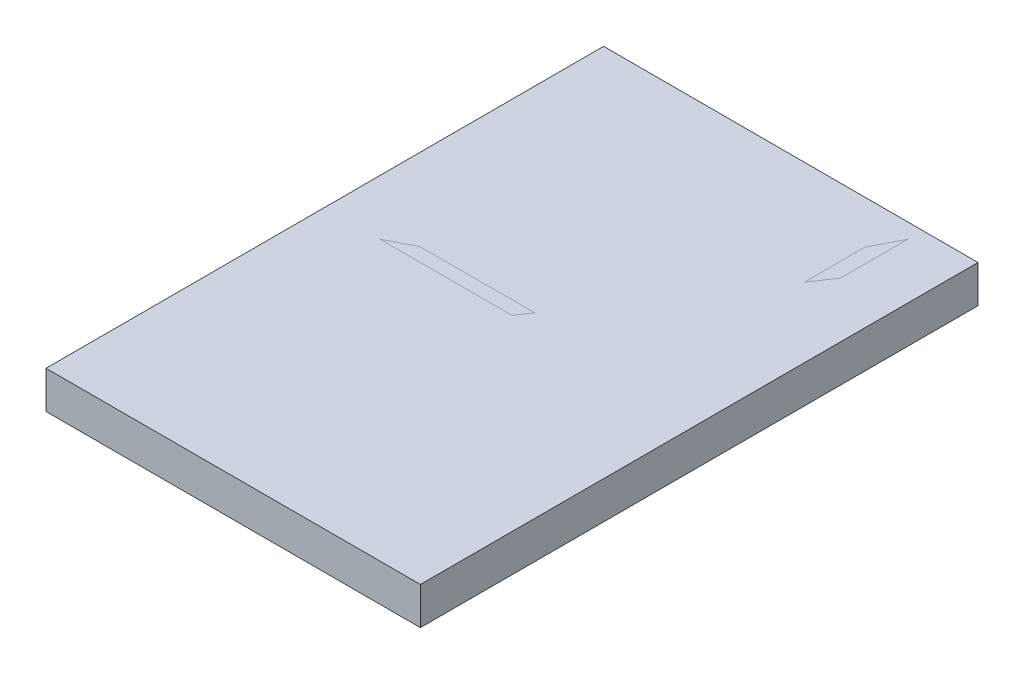
ISO-10303-21;
HEADER;
FILE_DESCRIPTION(('STEP AP214'),'2;1');
FILE_NAME('part.step','',(''),(''),'','','');
FILE_SCHEMA(('AUTOMOTIVE_DESIGN { 1 0 10303 214 1 1 1 1 }'));
ENDSEC;
DATA;
#1=APPLICATION_CONTEXT('core data for automotive mechanical design processes');
#2=APPLICATION_PROTOCOL_DEFINITION('international standard','automotive_design',2000,#1);
#3=PRODUCT_CONTEXT('',#1,'mechanical');
#4=PRODUCT('Part','Part','',(#3));
#5=PRODUCT_RELATED_PRODUCT_CATEGORY('part','',(#4));
#6=PRODUCT_DEFINITION_FORMATION('','',#4);
#7=PRODUCT_DEFINITION_CONTEXT('part definition',#1,'design');
#8=PRODUCT_DEFINITION('design','',#6,#7);
#9=PRODUCT_DEFINITION_SHAPE('','',#8);
#10=(LENGTH_UNIT() NAMED_UNIT(*) SI_UNIT(.MILLI.,.METRE.));
#11=(NAMED_UNIT(*) PLANE_ANGLE_UNIT() SI_UNIT($,.RADIAN.));
#12=(NAMED_UNIT(*) SI_UNIT($,.STERADIAN.) SOLID_ANGLE_UNIT());
#13=UNCERTAINTY_MEASURE_WITH_UNIT(LENGTH_MEASURE(1.E-05),#10,'distance_accuracy_value','');
#14=(GEOMETRIC_REPRESENTATION_CONTEXT(3) GLOBAL_UNCERTAINTY_ASSIGNED_CONTEXT((#13)) GLOBAL_UNIT_ASSIGNED_CONTEXT((#10,
#11,#12)) REPRESENTATION_CONTEXT('',''));
#15=CARTESIAN_POINT('',(0.,0.,0.));
#16=DIRECTION('',(0.,0.,1.));
#17=DIRECTION('',(1.,0.,0.));
#18=AXIS2_PLACEMENT_3D('',#15,#16,#17);
#19=CARTESIAN_POINT('',(68.2,0.,11.825));
#20=DIRECTION('',(1.,0.,0.));
#21=DIRECTION('',(0.,0.,-1.));
#22=AXIS2_PLACEMENT_3D('',#19,#20,#21);
#23=PLANE('',#22);
#24=DIRECTION('',(0.,0.,-1.));
#25=VECTOR('',#24,1.);
#26=CARTESIAN_POINT('',(68.2,8.,11.825));
#27=LINE('',#26,#25);
#28=CARTESIAN_POINT('',(68.2,8.,130.975));
#29=VERTEX_POINT('',#28);
#30=CARTESIAN_POINT('',(68.2,8.,11.825));
#31=VERTEX_POINT('',#30);
#32=EDGE_CURVE('E115',#29,#31,#27,.T.);
#33=ORIENTED_EDGE('',*,*,#32,.F.);
#34=DIRECTION('',(0.,1.,0.));
#35=VECTOR('',#34,1.);
#36=CARTESIAN_POINT('',(68.2,0.,130.975));
#37=LINE('',#36,#35);
#38=CARTESIAN_POINT('',(68.2,0.,130.975));
#39=VERTEX_POINT('',#38);
#40=EDGE_CURVE('E13',#39,#29,#37,.T.);
#41=ORIENTED_EDGE('',*,*,#40,.F.);
#42=DIRECTION('',(0.,0.,-1.));
#43=VECTOR('',#42,1.);
#44=CARTESIAN_POINT('',(68.2,0.,11.825));
#45=LINE('',#44,#43);
#46=CARTESIAN_POINT('',(68.2,0.,11.825));
#47=VERTEX_POINT('',#46);
#48=EDGE_CURVE('E109',#39,#47,#45,.T.);
#49=ORIENTED_EDGE('',*,*,#48,.T.);
#50=DIRECTION('',(0.,1.,0.));
#51=VECTOR('',#50,1.);
#52=CARTESIAN_POINT('',(68.2,0.,11.825));
#53=LINE('',#52,#51);
#54=EDGE_CURVE('E54',#47,#31,#53,.T.);
#55=ORIENTED_EDGE('',*,*,#54,.T.);
#56=EDGE_LOOP('',(#33,#41,#49,#55));
#57=FACE_BOUND('',#56,.T.);
#58=ADVANCED_FACE('F51',(#57),#23,.T.);
#59=CARTESIAN_POINT('',(-11.8,0.,130.975));
#60=DIRECTION('',(0.,0.,1.));
#61=DIRECTION('',(1.,0.,0.));
#62=AXIS2_PLACEMENT_3D('',#59,#60,#61);
#63=PLANE('',#62);
#64=DIRECTION('',(1.,0.,0.));
#65=VECTOR('',#64,1.);
#66=CARTESIAN_POINT('',(-11.8,8.,130.975));
#67=LINE('',#66,#65);
#68=CARTESIAN_POINT('',(-11.8,8.,130.975));
#69=VERTEX_POINT('',#68);
#70=EDGE_CURVE('E111',#69,#29,#67,.T.);
#71=ORIENTED_EDGE('',*,*,#70,.F.);
#72=DIRECTION('',(0.,1.,0.));
#73=VECTOR('',#72,1.);
#74=CARTESIAN_POINT('',(-11.8,0.,130.975));
#75=LINE('',#74,#73);
#76=CARTESIAN_POINT('',(-11.8,0.,130.975));
#77=VERTEX_POINT('',#76);
#78=EDGE_CURVE('E60',#77,#69,#75,.T.);
#79=ORIENTED_EDGE('',*,*,#78,.F.);
#80=DIRECTION('',(1.,0.,0.));
#81=VECTOR('',#80,1.);
#82=CARTESIAN_POINT('',(-11.8,0.,130.975));
#83=LINE('',#82,#81);
#84=EDGE_CURVE('E106',#77,#39,#83,.T.);
#85=ORIENTED_EDGE('',*,*,#84,.T.);
#86=ORIENTED_EDGE('',*,*,#40,.T.);
#87=EDGE_LOOP('',(#71,#79,#85,#86));
#88=FACE_BOUND('',#87,.T.);
#89=ADVANCED_FACE('F125',(#88),#63,.T.);
#90=CARTESIAN_POINT('',(-11.8,0.,11.825));
#91=DIRECTION('',(-1.,0.,0.));
#92=DIRECTION('',(0.,0.,1.));
#93=AXIS2_PLACEMENT_3D('',#90,#91,#92);
#94=PLANE('',#93);
#95=DIRECTION('',(0.,0.,1.));
#96=VECTOR('',#95,1.);
#97=CARTESIAN_POINT('',(-11.8,8.,11.825));
#98=LINE('',#97,#96);
#99=CARTESIAN_POINT('',(-11.8,8.,11.825));
#100=VERTEX_POINT('',#99);
#101=EDGE_CURVE('E101',#100,#69,#98,.T.);
#102=ORIENTED_EDGE('',*,*,#101,.F.);
#103=DIRECTION('',(0.,1.,0.));
#104=VECTOR('',#103,1.);
#105=CARTESIAN_POINT('',(-11.8,0.,11.825));
#106=LINE('',#105,#104);
#107=CARTESIAN_POINT('',(-11.8,0.,11.825));
#108=VERTEX_POINT('',#107);
#109=EDGE_CURVE('E96',#108,#100,#106,.T.);
#110=ORIENTED_EDGE('',*,*,#109,.F.);
#111=DIRECTION('',(0.,0.,1.));
#112=VECTOR('',#111,1.);
#113=CARTESIAN_POINT('',(-11.8,0.,11.825));
#114=LINE('',#113,#112);
#115=EDGE_CURVE('E99',#108,#77,#114,.T.);
#116=ORIENTED_EDGE('',*,*,#115,.T.);
#117=ORIENTED_EDGE('',*,*,#78,.T.);
#118=EDGE_LOOP('',(#102,#110,#116,#117));
#119=FACE_BOUND('',#118,.T.);
#120=ADVANCED_FACE('F98',(#119),#94,.T.);
#121=CARTESIAN_POINT('',(-11.8,0.,11.825));
#122=DIRECTION('',(0.,0.,-1.));
#123=DIRECTION('',(-1.,0.,0.));
#124=AXIS2_PLACEMENT_3D('',#121,#122,#123);
#125=PLANE('',#124);
#126=DIRECTION('',(-1.,0.,0.));
#127=VECTOR('',#126,1.);
#128=CARTESIAN_POINT('',(-11.8,8.,11.825));
#129=LINE('',#128,#127);
#130=EDGE_CURVE('E118',#31,#100,#129,.T.);
#131=ORIENTED_EDGE('',*,*,#130,.F.);
#132=ORIENTED_EDGE('',*,*,#54,.F.);
#133=DIRECTION('',(-1.,0.,0.));
#134=VECTOR('',#133,1.);
#135=CARTESIAN_POINT('',(-11.8,0.,11.825));
#136=LINE('',#135,#134);
#137=EDGE_CURVE('E105',#47,#108,#136,.T.);
#138=ORIENTED_EDGE('',*,*,#137,.T.);
#139=ORIENTED_EDGE('',*,*,#109,.T.);
#140=EDGE_LOOP('',(#131,#132,#138,#139));
#141=FACE_BOUND('',#140,.T.);
#142=ADVANCED_FACE('F108',(#141),#125,.T.);
#143=CARTESIAN_POINT('',(0.,0.,0.));
#144=DIRECTION('',(0.,1.,0.));
#145=DIRECTION('',(0.,0.,1.));
#146=AXIS2_PLACEMENT_3D('',#143,#144,#145);
#147=PLANE('',#146);
#148=ORIENTED_EDGE('',*,*,#48,.F.);
#149=ORIENTED_EDGE('',*,*,#84,.F.);
#150=ORIENTED_EDGE('',*,*,#115,.F.);
#151=ORIENTED_EDGE('',*,*,#137,.F.);
#152=EDGE_LOOP('',(#148,#149,#150,#151));
#153=FACE_BOUND('',#152,.T.);
#154=ADVANCED_FACE('F104',(#153),#147,.F.);
#155=CARTESIAN_POINT('',(0.,8.,0.));
#156=DIRECTION('',(0.,1.,0.));
#157=DIRECTION('',(0.,0.,1.));
#158=AXIS2_PLACEMENT_3D('',#155,#156,#157);
#159=PLANE('',#158);
#160=ORIENTED_EDGE('',*,*,#32,.T.);
#161=ORIENTED_EDGE('',*,*,#130,.T.);
#162=ORIENTED_EDGE('',*,*,#101,.T.);
#163=ORIENTED_EDGE('',*,*,#70,.T.);
#164=EDGE_LOOP('',(#160,#161,#162,#163));
#165=FACE_BOUND('',#164,.T.);
#166=ADVANCED_FACE('F124',(#165),#159,.T.);
#167=CLOSED_SHELL('',(#58,#89,#120,#142,#154,#166));
#168=MANIFOLD_SOLID_BREP('B2_NOT_SHOWN',#167);
#169=CARTESIAN_POINT('',(0.,8.,0.));
#170=DIRECTION('',(0.,1.,0.));
#171=DIRECTION('',(0.,0.,1.));
#172=AXIS2_PLACEMENT_3D('',#169,#170,#171);
#173=PLANE('',#172);
#174=DIRECTION('',(1.,0.,0.));
#175=VECTOR('',#174,1.);
#176=CARTESIAN_POINT('',(0.,8.,15.));
#177=LINE('',#176,#175);
#178=CARTESIAN_POINT('',(0.,8.,15.));
#179=VERTEX_POINT('',#178);
#180=CARTESIAN_POINT('',(56.4,8.,15.));
#181=VERTEX_POINT('',#180);
#182=EDGE_CURVE('E189',#179,#181,#177,.T.);
#183=ORIENTED_EDGE('',*,*,#182,.F.);
#184=DIRECTION('',(0.,0.,1.));
#185=VECTOR('',#184,1.);
#186=CARTESIAN_POINT('',(0.,8.,0.));
#187=LINE('',#186,#185);
#188=CARTESIAN_POINT('',(0.,8.,71.4));
#189=VERTEX_POINT('',#188);
#190=EDGE_CURVE('E227',#179,#189,#187,.T.);
#191=ORIENTED_EDGE('',*,*,#190,.T.);
#192=DIRECTION('',(1.,0.,0.));
#193=VECTOR('',#192,1.);
#194=CARTESIAN_POINT('',(0.,8.,71.4));
#195=LINE('',#194,#193);
#196=CARTESIAN_POINT('',(56.4,8.,71.4));
#197=VERTEX_POINT('',#196);
#198=EDGE_CURVE('E277',#189,#197,#195,.T.);
#199=ORIENTED_EDGE('',*,*,#198,.T.);
#200=DIRECTION('',(0.,0.,-1.));
#201=VECTOR('',#200,1.);
#202=CARTESIAN_POINT('',(56.4,8.,0.));
#203=LINE('',#202,#201);
#204=EDGE_CURVE('E229',#197,#181,#203,.T.);
#205=ORIENTED_EDGE('',*,*,#204,.T.);
#206=EDGE_LOOP('',(#183,#191,#199,#205));
#207=FACE_BOUND('',#206,.T.);
#208=CARTESIAN_POINT('',(4.58,8.,66.82));
#209=DIRECTION('',(0.,1.,0.));
#210=DIRECTION('',(0.,0.,-1.));
#211=AXIS2_PLACEMENT_3D('',#208,#209,#210);
#212=CIRCLE('',#211,2.);
#213=CARTESIAN_POINT('',(4.58,8.,64.82));
#214=VERTEX_POINT('',#213);
#215=EDGE_CURVE('E269',#214,#214,#212,.T.);
#216=ORIENTED_EDGE('',*,*,#215,.F.);
#217=EDGE_LOOP('',(#216));
#218=FACE_BOUND('',#217,.T.);
#219=CARTESIAN_POINT('',(51.82,8.,66.82));
#220=DIRECTION('',(0.,1.,0.));
#221=DIRECTION('',(0.,0.,1.));
#222=AXIS2_PLACEMENT_3D('',#219,#220,#221);
#223=CIRCLE('',#222,2.);
#224=CARTESIAN_POINT('',(51.82,8.,68.82));
#225=VERTEX_POINT('',#224);
#226=EDGE_CURVE('E263',#225,#225,#223,.T.);
#227=ORIENTED_EDGE('',*,*,#226,.F.);
#228=EDGE_LOOP('',(#227));
#229=FACE_BOUND('',#228,.T.);
#230=CARTESIAN_POINT('',(51.82,8.,19.58));
#231=DIRECTION('',(0.,1.,0.));
#232=DIRECTION('',(0.,0.,-1.));
#233=AXIS2_PLACEMENT_3D('',#230,#231,#232);
#234=CIRCLE('',#233,2.);
#235=CARTESIAN_POINT('',(51.82,8.,17.58));
#236=VERTEX_POINT('',#235);
#237=EDGE_CURVE('E257',#236,#236,#234,.T.);
#238=ORIENTED_EDGE('',*,*,#237,.F.);
#239=EDGE_LOOP('',(#238));
#240=FACE_BOUND('',#239,.T.);
#241=CARTESIAN_POINT('',(4.58,8.,19.58));
#242=DIRECTION('',(0.,1.,0.));
#243=DIRECTION('',(0.,0.,1.));
#244=AXIS2_PLACEMENT_3D('',#241,#242,#243);
#245=CIRCLE('',#244,2.);
#246=CARTESIAN_POINT('',(4.58,8.,21.58));
#247=VERTEX_POINT('',#246);
#248=EDGE_CURVE('E251',#247,#247,#245,.T.);
#249=ORIENTED_EDGE('',*,*,#248,.F.);
#250=EDGE_LOOP('',(#249));
#251=FACE_BOUND('',#250,.T.);
#252=CARTESIAN_POINT('',(28.2,8.,43.2));
#253=DIRECTION('',(0.,1.,0.));
#254=DIRECTION('',(0.,0.,1.));
#255=AXIS2_PLACEMENT_3D('',#252,#253,#254);
#256=CIRCLE('',#255,16.);
#257=CARTESIAN_POINT('',(28.2,8.,59.2));
#258=VERTEX_POINT('',#257);
#259=EDGE_CURVE('E239',#258,#258,#256,.T.);
#260=ORIENTED_EDGE('',*,*,#259,.F.);
#261=EDGE_LOOP('',(#260));
#262=FACE_BOUND('',#261,.T.);
#263=ADVANCED_FACE('F174',(#207,#218,#229,#240,#251,#262),#173,.T.);
#264=CARTESIAN_POINT('',(0.,0.,0.));
#265=DIRECTION('',(0.,1.,0.));
#266=DIRECTION('',(0.,0.,1.));
#267=AXIS2_PLACEMENT_3D('',#264,#265,#266);
#268=PLANE('',#267);
#269=CARTESIAN_POINT('',(4.58,0.,66.82));
#270=DIRECTION('',(0.,1.,0.));
#271=DIRECTION('',(0.,0.,-1.));
#272=AXIS2_PLACEMENT_3D('',#269,#270,#271);
#273=CIRCLE('',#272,2.);
#274=CARTESIAN_POINT('',(4.58,0.,64.82));
#275=VERTEX_POINT('',#274);
#276=EDGE_CURVE('E266',#275,#275,#273,.T.);
#277=ORIENTED_EDGE('',*,*,#276,.T.);
#278=EDGE_LOOP('',(#277));
#279=FACE_BOUND('',#278,.T.);
#280=CARTESIAN_POINT('',(51.82,0.,66.82));
#281=DIRECTION('',(0.,1.,0.));
#282=DIRECTION('',(0.,0.,1.));
#283=AXIS2_PLACEMENT_3D('',#280,#281,#282);
#284=CIRCLE('',#283,2.);
#285=CARTESIAN_POINT('',(51.82,0.,68.82));
#286=VERTEX_POINT('',#285);
#287=EDGE_CURVE('E260',#286,#286,#284,.T.);
#288=ORIENTED_EDGE('',*,*,#287,.T.);
#289=EDGE_LOOP('',(#288));
#290=FACE_BOUND('',#289,.T.);
#291=CARTESIAN_POINT('',(51.82,0.,19.58));
#292=DIRECTION('',(0.,1.,0.));
#293=DIRECTION('',(0.,0.,-1.));
#294=AXIS2_PLACEMENT_3D('',#291,#292,#293);
#295=CIRCLE('',#294,2.);
#296=CARTESIAN_POINT('',(51.82,0.,17.58));
#297=VERTEX_POINT('',#296);
#298=EDGE_CURVE('E254',#297,#297,#295,.T.);
#299=ORIENTED_EDGE('',*,*,#298,.T.);
#300=EDGE_LOOP('',(#299));
#301=FACE_BOUND('',#300,.T.);
#302=CARTESIAN_POINT('',(4.58,0.,19.58));
#303=DIRECTION('',(0.,1.,0.));
#304=DIRECTION('',(0.,0.,1.));
#305=AXIS2_PLACEMENT_3D('',#302,#303,#304);
#306=CIRCLE('',#305,2.);
#307=CARTESIAN_POINT('',(4.58,0.,21.58));
#308=VERTEX_POINT('',#307);
#309=EDGE_CURVE('E248',#308,#308,#306,.T.);
#310=ORIENTED_EDGE('',*,*,#309,.T.);
#311=EDGE_LOOP('',(#310));
#312=FACE_BOUND('',#311,.T.);
#313=CARTESIAN_POINT('',(28.2,0.,43.2));
#314=DIRECTION('',(0.,1.,0.));
#315=DIRECTION('',(0.,0.,1.));
#316=AXIS2_PLACEMENT_3D('',#313,#314,#315);
#317=CIRCLE('',#316,10.);
#318=CARTESIAN_POINT('',(28.2,0.,53.2));
#319=VERTEX_POINT('',#318);
#320=EDGE_CURVE('E242',#319,#319,#317,.T.);
#321=ORIENTED_EDGE('',*,*,#320,.T.);
#322=EDGE_LOOP('',(#321));
#323=FACE_BOUND('',#322,.T.);
#324=DIRECTION('',(0.,0.,1.));
#325=VECTOR('',#324,1.);
#326=CARTESIAN_POINT('',(0.,0.,0.));
#327=LINE('',#326,#325);
#328=CARTESIAN_POINT('',(0.,0.,15.));
#329=VERTEX_POINT('',#328);
#330=CARTESIAN_POINT('',(0.,0.,71.4));
#331=VERTEX_POINT('',#330);
#332=EDGE_CURVE('E196',#329,#331,#327,.T.);
#333=ORIENTED_EDGE('',*,*,#332,.F.);
#334=DIRECTION('',(1.,0.,0.));
#335=VECTOR('',#334,1.);
#336=CARTESIAN_POINT('',(0.,0.,15.));
#337=LINE('',#336,#335);
#338=CARTESIAN_POINT('',(56.4,0.,15.));
#339=VERTEX_POINT('',#338);
#340=EDGE_CURVE('E215',#329,#339,#337,.T.);
#341=ORIENTED_EDGE('',*,*,#340,.T.);
#342=DIRECTION('',(0.,0.,-1.));
#343=VECTOR('',#342,1.);
#344=CARTESIAN_POINT('',(56.4,0.,0.));
#345=LINE('',#344,#343);
#346=CARTESIAN_POINT('',(56.4,0.,71.4));
#347=VERTEX_POINT('',#346);
#348=EDGE_CURVE('E222',#347,#339,#345,.T.);
#349=ORIENTED_EDGE('',*,*,#348,.F.);
#350=DIRECTION('',(1.,0.,0.));
#351=VECTOR('',#350,1.);
#352=CARTESIAN_POINT('',(0.,0.,71.4));
#353=LINE('',#352,#351);
#354=EDGE_CURVE('E279',#331,#347,#353,.T.);
#355=ORIENTED_EDGE('',*,*,#354,.F.);
#356=EDGE_LOOP('',(#333,#341,#349,#355));
#357=FACE_BOUND('',#356,.T.);
#358=ADVANCED_FACE('F221',(#279,#290,#301,#312,#323,#357),#268,.F.);
#359=CARTESIAN_POINT('',(0.,8.,0.));
#360=DIRECTION('',(1.,0.,0.));
#361=DIRECTION('',(0.,0.,-1.));
#362=AXIS2_PLACEMENT_3D('',#359,#360,#361);
#363=PLANE('',#362);
#364=ORIENTED_EDGE('',*,*,#190,.F.);
#365=DIRECTION('',(0.,-1.,0.));
#366=VECTOR('',#365,1.);
#367=CARTESIAN_POINT('',(0.,8.,15.));
#368=LINE('',#367,#366);
#369=EDGE_CURVE('E281',#179,#329,#368,.T.);
#370=ORIENTED_EDGE('',*,*,#369,.T.);
#371=ORIENTED_EDGE('',*,*,#332,.T.);
#372=DIRECTION('',(0.,-1.,0.));
#373=VECTOR('',#372,1.);
#374=CARTESIAN_POINT('',(0.,8.,71.4));
#375=LINE('',#374,#373);
#376=EDGE_CURVE('E272',#189,#331,#375,.T.);
#377=ORIENTED_EDGE('',*,*,#376,.F.);
#378=EDGE_LOOP('',(#364,#370,#371,#377));
#379=FACE_BOUND('',#378,.T.);
#380=ADVANCED_FACE('F176',(#379),#363,.F.);
#381=CARTESIAN_POINT('',(56.4,8.,0.));
#382=DIRECTION('',(-1.,0.,0.));
#383=DIRECTION('',(0.,0.,1.));
#384=AXIS2_PLACEMENT_3D('',#381,#382,#383);
#385=PLANE('',#384);
#386=ORIENTED_EDGE('',*,*,#348,.T.);
#387=DIRECTION('',(0.,1.,0.));
#388=VECTOR('',#387,1.);
#389=CARTESIAN_POINT('',(56.4,8.,15.));
#390=LINE('',#389,#388);
#391=EDGE_CURVE('E49',#339,#181,#390,.T.);
#392=ORIENTED_EDGE('',*,*,#391,.T.);
#393=ORIENTED_EDGE('',*,*,#204,.F.);
#394=DIRECTION('',(0.,1.,0.));
#395=VECTOR('',#394,1.);
#396=CARTESIAN_POINT('',(56.4,8.,71.4));
#397=LINE('',#396,#395);
#398=EDGE_CURVE('E182',#347,#197,#397,.T.);
#399=ORIENTED_EDGE('',*,*,#398,.F.);
#400=EDGE_LOOP('',(#386,#392,#393,#399));
#401=FACE_BOUND('',#400,.T.);
#402=ADVANCED_FACE('F225',(#401),#385,.F.);
#403=CARTESIAN_POINT('',(28.2,2.,43.2));
#404=DIRECTION('',(0.,1.,0.));
#405=DIRECTION('',(0.,0.,1.));
#406=AXIS2_PLACEMENT_3D('',#403,#404,#405);
#407=CYLINDRICAL_SURFACE('',#406,16.);
#408=CARTESIAN_POINT('',(28.2,2.,43.2));
#409=DIRECTION('',(0.,1.,0.));
#410=DIRECTION('',(0.,0.,1.));
#411=AXIS2_PLACEMENT_3D('',#408,#409,#410);
#412=CIRCLE('',#411,16.);
#413=CARTESIAN_POINT('',(28.2,2.,59.2));
#414=VERTEX_POINT('',#413);
#415=EDGE_CURVE('E231',#414,#414,#412,.T.);
#416=ORIENTED_EDGE('',*,*,#415,.F.);
#417=EDGE_LOOP('',(#416));
#418=FACE_BOUND('',#417,.T.);
#419=ORIENTED_EDGE('',*,*,#259,.T.);
#420=EDGE_LOOP('',(#419));
#421=FACE_BOUND('',#420,.T.);
#422=ADVANCED_FACE('F305',(#418,#421),#407,.F.);
#423=CARTESIAN_POINT('',(28.2,2.,43.2));
#424=DIRECTION('',(0.,1.,0.));
#425=DIRECTION('',(0.,0.,1.));
#426=AXIS2_PLACEMENT_3D('',#423,#424,#425);
#427=PLANE('',#426);
#428=CARTESIAN_POINT('',(28.2,2.,43.2));
#429=DIRECTION('',(0.,1.,0.));
#430=DIRECTION('',(0.,0.,1.));
#431=AXIS2_PLACEMENT_3D('',#428,#429,#430);
#432=CIRCLE('',#431,10.);
#433=CARTESIAN_POINT('',(28.2,2.,53.2));
#434=VERTEX_POINT('',#433);
#435=EDGE_CURVE('E245',#434,#434,#432,.T.);
#436=ORIENTED_EDGE('',*,*,#435,.F.);
#437=EDGE_LOOP('',(#436));
#438=FACE_BOUND('',#437,.T.);
#439=ORIENTED_EDGE('',*,*,#415,.T.);
#440=EDGE_LOOP('',(#439));
#441=FACE_BOUND('',#440,.T.);
#442=ADVANCED_FACE('F312',(#438,#441),#427,.T.);
#443=CARTESIAN_POINT('',(28.2,0.,43.2));
#444=DIRECTION('',(0.,1.,0.));
#445=DIRECTION('',(0.,0.,1.));
#446=AXIS2_PLACEMENT_3D('',#443,#444,#445);
#447=CYLINDRICAL_SURFACE('',#446,10.);
#448=ORIENTED_EDGE('',*,*,#320,.F.);
#449=EDGE_LOOP('',(#448));
#450=FACE_BOUND('',#449,.T.);
#451=ORIENTED_EDGE('',*,*,#435,.T.);
#452=EDGE_LOOP('',(#451));
#453=FACE_BOUND('',#452,.T.);
#454=ADVANCED_FACE('F365',(#450,#453),#447,.F.);
#455=CARTESIAN_POINT('',(4.58,0.,19.58));
#456=DIRECTION('',(0.,1.,0.));
#457=DIRECTION('',(0.,0.,1.));
#458=AXIS2_PLACEMENT_3D('',#455,#456,#457);
#459=CYLINDRICAL_SURFACE('',#458,2.);
#460=ORIENTED_EDGE('',*,*,#309,.F.);
#461=EDGE_LOOP('',(#460));
#462=FACE_BOUND('',#461,.T.);
#463=ORIENTED_EDGE('',*,*,#248,.T.);
#464=EDGE_LOOP('',(#463));
#465=FACE_BOUND('',#464,.T.);
#466=ADVANCED_FACE('F355',(#462,#465),#459,.F.);
#467=CARTESIAN_POINT('',(51.82,0.,19.58));
#468=DIRECTION('',(0.,1.,0.));
#469=DIRECTION('',(0.,0.,1.));
#470=AXIS2_PLACEMENT_3D('',#467,#468,#469);
#471=CYLINDRICAL_SURFACE('',#470,2.);
#472=ORIENTED_EDGE('',*,*,#298,.F.);
#473=EDGE_LOOP('',(#472));
#474=FACE_BOUND('',#473,.T.);
#475=ORIENTED_EDGE('',*,*,#237,.T.);
#476=EDGE_LOOP('',(#475));
#477=FACE_BOUND('',#476,.T.);
#478=ADVANCED_FACE('F345',(#474,#477),#471,.F.);
#479=CARTESIAN_POINT('',(51.82,0.,66.82));
#480=DIRECTION('',(0.,1.,0.));
#481=DIRECTION('',(0.,0.,1.));
#482=AXIS2_PLACEMENT_3D('',#479,#480,#481);
#483=CYLINDRICAL_SURFACE('',#482,2.);
#484=ORIENTED_EDGE('',*,*,#287,.F.);
#485=EDGE_LOOP('',(#484));
#486=FACE_BOUND('',#485,.T.);
#487=ORIENTED_EDGE('',*,*,#226,.T.);
#488=EDGE_LOOP('',(#487));
#489=FACE_BOUND('',#488,.T.);
#490=ADVANCED_FACE('F294',(#486,#489),#483,.F.);
#491=CARTESIAN_POINT('',(4.58,0.,66.82));
#492=DIRECTION('',(0.,1.,0.));
#493=DIRECTION('',(0.,0.,1.));
#494=AXIS2_PLACEMENT_3D('',#491,#492,#493);
#495=CYLINDRICAL_SURFACE('',#494,2.);
#496=ORIENTED_EDGE('',*,*,#276,.F.);
#497=EDGE_LOOP('',(#496));
#498=FACE_BOUND('',#497,.T.);
#499=ORIENTED_EDGE('',*,*,#215,.T.);
#500=EDGE_LOOP('',(#499));
#501=FACE_BOUND('',#500,.T.);
#502=ADVANCED_FACE('F287',(#498,#501),#495,.F.);
#503=CARTESIAN_POINT('',(0.,0.,71.4));
#504=DIRECTION('',(0.,0.,1.));
#505=DIRECTION('',(1.,0.,0.));
#506=AXIS2_PLACEMENT_3D('',#503,#504,#505);
#507=PLANE('',#506);
#508=ORIENTED_EDGE('',*,*,#198,.F.);
#509=ORIENTED_EDGE('',*,*,#376,.T.);
#510=ORIENTED_EDGE('',*,*,#354,.T.);
#511=ORIENTED_EDGE('',*,*,#398,.T.);
#512=EDGE_LOOP('',(#508,#509,#510,#511));
#513=FACE_BOUND('',#512,.T.);
#514=ADVANCED_FACE('F285',(#513),#507,.T.);
#515=CARTESIAN_POINT('',(0.,0.,15.));
#516=DIRECTION('',(0.,0.,1.));
#517=DIRECTION('',(1.,0.,0.));
#518=AXIS2_PLACEMENT_3D('',#515,#516,#517);
#519=PLANE('',#518);
#520=ORIENTED_EDGE('',*,*,#369,.F.);
#521=ORIENTED_EDGE('',*,*,#182,.T.);
#522=ORIENTED_EDGE('',*,*,#391,.F.);
#523=ORIENTED_EDGE('',*,*,#340,.F.);
#524=EDGE_LOOP('',(#520,#521,#522,#523));
#525=FACE_BOUND('',#524,.T.);
#526=ADVANCED_FACE('F214',(#525),#519,.F.);
#527=CLOSED_SHELL('',(#263,#358,#380,#402,#422,#442,#454,#466,#478,#490,#502,#514,#526));
#528=MANIFOLD_SOLID_BREP('B7',#527);
#529=ADVANCED_BREP_SHAPE_REPRESENTATION('',(#18,#168,#528),#14);
#530=SHAPE_DEFINITION_REPRESENTATION(#9,#529);
ENDSEC;
END-ISO-10303-21;
